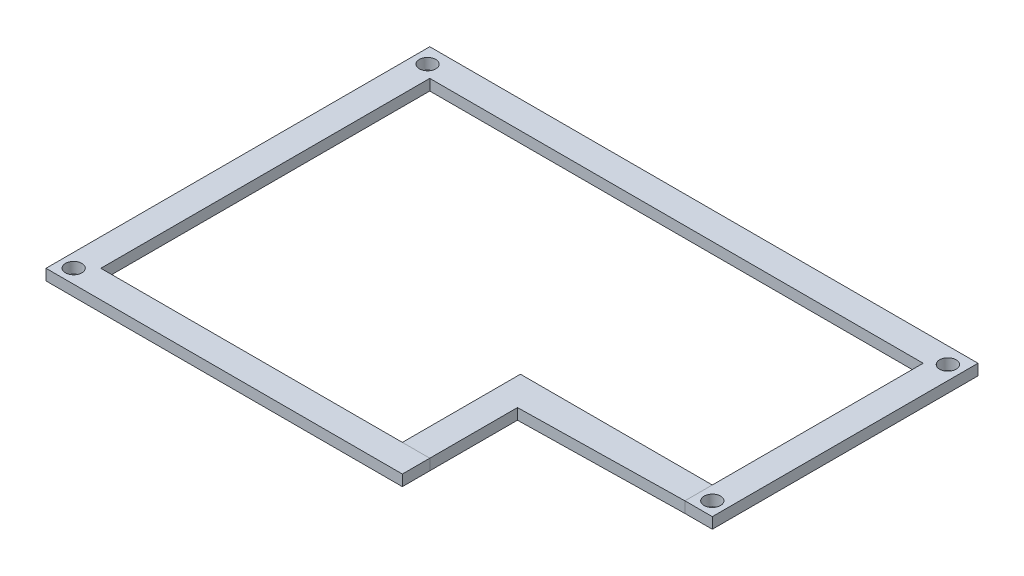
ISO-10303-21;
HEADER;
FILE_DESCRIPTION(('STEP AP214'),'2;1');
FILE_NAME('part.step','',(''),(''),'','','');
FILE_SCHEMA(('AUTOMOTIVE_DESIGN { 1 0 10303 214 1 1 1 1 }'));
ENDSEC;
DATA;
#1=APPLICATION_CONTEXT('core data for automotive mechanical design processes');
#2=APPLICATION_PROTOCOL_DEFINITION('international standard','automotive_design',2000,#1);
#3=PRODUCT_CONTEXT('',#1,'mechanical');
#4=PRODUCT('Part','Part','',(#3));
#5=PRODUCT_RELATED_PRODUCT_CATEGORY('part','',(#4));
#6=PRODUCT_DEFINITION_FORMATION('','',#4);
#7=PRODUCT_DEFINITION_CONTEXT('part definition',#1,'design');
#8=PRODUCT_DEFINITION('design','',#6,#7);
#9=PRODUCT_DEFINITION_SHAPE('','',#8);
#10=(LENGTH_UNIT() NAMED_UNIT(*) SI_UNIT(.MILLI.,.METRE.));
#11=(NAMED_UNIT(*) PLANE_ANGLE_UNIT() SI_UNIT($,.RADIAN.));
#12=(NAMED_UNIT(*) SI_UNIT($,.STERADIAN.) SOLID_ANGLE_UNIT());
#13=UNCERTAINTY_MEASURE_WITH_UNIT(LENGTH_MEASURE(1.E-05),#10,'distance_accuracy_value','');
#14=(GEOMETRIC_REPRESENTATION_CONTEXT(3) GLOBAL_UNCERTAINTY_ASSIGNED_CONTEXT((#13)) GLOBAL_UNIT_ASSIGNED_CONTEXT((#10,
#11,#12)) REPRESENTATION_CONTEXT('',''));
#15=CARTESIAN_POINT('',(0.,0.,0.));
#16=DIRECTION('',(0.,0.,1.));
#17=DIRECTION('',(1.,0.,0.));
#18=AXIS2_PLACEMENT_3D('',#15,#16,#17);
#19=CARTESIAN_POINT('',(10.,0.,30.));
#20=DIRECTION('',(0.,0.,1.));
#21=DIRECTION('',(1.,0.,0.));
#22=AXIS2_PLACEMENT_3D('',#19,#20,#21);
#23=PLANE('',#22);
#24=DIRECTION('',(1.,0.,0.));
#25=VECTOR('',#24,1.);
#26=CARTESIAN_POINT('',(10.,2.,30.));
#27=LINE('',#26,#25);
#28=CARTESIAN_POINT('',(10.,2.,30.));
#29=VERTEX_POINT('',#28);
#30=CARTESIAN_POINT('',(15.,2.,30.));
#31=VERTEX_POINT('',#30);
#32=EDGE_CURVE('E138',#29,#31,#27,.T.);
#33=ORIENTED_EDGE('',*,*,#32,.F.);
#34=DIRECTION('',(0.,1.,0.));
#35=VECTOR('',#34,1.);
#36=CARTESIAN_POINT('',(10.,0.,30.));
#37=LINE('',#36,#35);
#38=CARTESIAN_POINT('',(10.,0.,30.));
#39=VERTEX_POINT('',#38);
#40=EDGE_CURVE('E12',#39,#29,#37,.T.);
#41=ORIENTED_EDGE('',*,*,#40,.F.);
#42=DIRECTION('',(1.,0.,0.));
#43=VECTOR('',#42,1.);
#44=CARTESIAN_POINT('',(10.,0.,30.));
#45=LINE('',#44,#43);
#46=CARTESIAN_POINT('',(15.,0.,30.));
#47=VERTEX_POINT('',#46);
#48=EDGE_CURVE('E152',#39,#47,#45,.T.);
#49=ORIENTED_EDGE('',*,*,#48,.T.);
#50=DIRECTION('',(0.,1.,0.));
#51=VECTOR('',#50,1.);
#52=CARTESIAN_POINT('',(15.,0.,30.));
#53=LINE('',#52,#51);
#54=EDGE_CURVE('E56',#47,#31,#53,.T.);
#55=ORIENTED_EDGE('',*,*,#54,.T.);
#56=EDGE_LOOP('',(#33,#41,#49,#55));
#57=FACE_BOUND('',#56,.T.);
#58=ADVANCED_FACE('F53',(#57),#23,.T.);
#59=CARTESIAN_POINT('',(9.99999999999999,0.,8.45999999999999));
#60=DIRECTION('',(-1.,0.,0.));
#61=DIRECTION('',(0.,0.,1.));
#62=AXIS2_PLACEMENT_3D('',#59,#60,#61);
#63=PLANE('',#62);
#64=DIRECTION('',(0.,0.,1.));
#65=VECTOR('',#64,1.);
#66=CARTESIAN_POINT('',(9.99999999999999,2.,8.45999999999999));
#67=LINE('',#66,#65);
#68=CARTESIAN_POINT('',(9.99999999999999,2.,8.45999999999999));
#69=VERTEX_POINT('',#68);
#70=EDGE_CURVE('E150',#69,#29,#67,.T.);
#71=ORIENTED_EDGE('',*,*,#70,.F.);
#72=DIRECTION('',(0.,1.,0.));
#73=VECTOR('',#72,1.);
#74=CARTESIAN_POINT('',(9.99999999999999,0.,8.45999999999999));
#75=LINE('',#74,#73);
#76=CARTESIAN_POINT('',(9.99999999999999,0.,8.45999999999999));
#77=VERTEX_POINT('',#76);
#78=EDGE_CURVE('E62',#77,#69,#75,.T.);
#79=ORIENTED_EDGE('',*,*,#78,.F.);
#80=DIRECTION('',(0.,0.,1.));
#81=VECTOR('',#80,1.);
#82=CARTESIAN_POINT('',(9.99999999999999,0.,8.45999999999999));
#83=LINE('',#82,#81);
#84=EDGE_CURVE('E128',#77,#39,#83,.T.);
#85=ORIENTED_EDGE('',*,*,#84,.T.);
#86=ORIENTED_EDGE('',*,*,#40,.T.);
#87=EDGE_LOOP('',(#71,#79,#85,#86));
#88=FACE_BOUND('',#87,.T.);
#89=ADVANCED_FACE('F160',(#88),#63,.T.);
#90=CARTESIAN_POINT('',(45.,0.,8.45999999999998));
#91=DIRECTION('',(0.,0.,-1.));
#92=DIRECTION('',(-1.,0.,0.));
#93=AXIS2_PLACEMENT_3D('',#90,#91,#92);
#94=PLANE('',#93);
#95=DIRECTION('',(-1.,0.,0.));
#96=VECTOR('',#95,1.);
#97=CARTESIAN_POINT('',(45.,2.,8.45999999999998));
#98=LINE('',#97,#96);
#99=CARTESIAN_POINT('',(45.,2.,8.45999999999998));
#100=VERTEX_POINT('',#99);
#101=EDGE_CURVE('E115',#100,#69,#98,.T.);
#102=ORIENTED_EDGE('',*,*,#101,.F.);
#103=DIRECTION('',(0.,1.,0.));
#104=VECTOR('',#103,1.);
#105=CARTESIAN_POINT('',(45.,0.,8.45999999999998));
#106=LINE('',#105,#104);
#107=CARTESIAN_POINT('',(45.,0.,8.45999999999998));
#108=VERTEX_POINT('',#107);
#109=EDGE_CURVE('E110',#108,#100,#106,.T.);
#110=ORIENTED_EDGE('',*,*,#109,.F.);
#111=DIRECTION('',(-1.,0.,0.));
#112=VECTOR('',#111,1.);
#113=CARTESIAN_POINT('',(45.,0.,8.45999999999998));
#114=LINE('',#113,#112);
#115=EDGE_CURVE('E113',#108,#77,#114,.T.);
#116=ORIENTED_EDGE('',*,*,#115,.T.);
#117=ORIENTED_EDGE('',*,*,#78,.T.);
#118=EDGE_LOOP('',(#102,#110,#116,#117));
#119=FACE_BOUND('',#118,.T.);
#120=ADVANCED_FACE('F112',(#119),#94,.T.);
#121=CARTESIAN_POINT('',(45.,0.,13.46));
#122=DIRECTION('',(1.,0.,0.));
#123=DIRECTION('',(0.,0.,-1.));
#124=AXIS2_PLACEMENT_3D('',#121,#122,#123);
#125=PLANE('',#124);
#126=DIRECTION('',(0.,0.,-1.));
#127=VECTOR('',#126,1.);
#128=CARTESIAN_POINT('',(45.,2.,13.46));
#129=LINE('',#128,#127);
#130=CARTESIAN_POINT('',(45.,2.,13.46));
#131=VERTEX_POINT('',#130);
#132=EDGE_CURVE('E147',#131,#100,#129,.T.);
#133=ORIENTED_EDGE('',*,*,#132,.F.);
#134=DIRECTION('',(0.,1.,0.));
#135=VECTOR('',#134,1.);
#136=CARTESIAN_POINT('',(45.,0.,13.46));
#137=LINE('',#136,#135);
#138=CARTESIAN_POINT('',(45.,0.,13.46));
#139=VERTEX_POINT('',#138);
#140=EDGE_CURVE('E120',#139,#131,#137,.T.);
#141=ORIENTED_EDGE('',*,*,#140,.F.);
#142=DIRECTION('',(0.,0.,-1.));
#143=VECTOR('',#142,1.);
#144=CARTESIAN_POINT('',(45.,0.,13.46));
#145=LINE('',#144,#143);
#146=EDGE_CURVE('E126',#139,#108,#145,.T.);
#147=ORIENTED_EDGE('',*,*,#146,.T.);
#148=ORIENTED_EDGE('',*,*,#109,.T.);
#149=EDGE_LOOP('',(#133,#141,#147,#148));
#150=FACE_BOUND('',#149,.T.);
#151=ADVANCED_FACE('F130',(#150),#125,.T.);
#152=CARTESIAN_POINT('',(15.,0.,14.));
#153=DIRECTION('',(0.0179970847083967,0.,0.999838039355374));
#154=DIRECTION('',(0.999838039355374,0.,-0.0179970847083967));
#155=AXIS2_PLACEMENT_3D('',#152,#153,#154);
#156=PLANE('',#155);
#157=DIRECTION('',(0.999838039355374,0.,-0.0179970847083967));
#158=VECTOR('',#157,1.);
#159=CARTESIAN_POINT('',(15.,2.,14.));
#160=LINE('',#159,#158);
#161=CARTESIAN_POINT('',(15.,2.,14.));
#162=VERTEX_POINT('',#161);
#163=EDGE_CURVE('E144',#162,#131,#160,.T.);
#164=ORIENTED_EDGE('',*,*,#163,.F.);
#165=DIRECTION('',(0.,1.,0.));
#166=VECTOR('',#165,1.);
#167=CARTESIAN_POINT('',(15.,0.,14.));
#168=LINE('',#167,#166);
#169=CARTESIAN_POINT('',(15.,0.,14.));
#170=VERTEX_POINT('',#169);
#171=EDGE_CURVE('E155',#170,#162,#168,.T.);
#172=ORIENTED_EDGE('',*,*,#171,.F.);
#173=DIRECTION('',(0.999838039355374,0.,-0.0179970847083967));
#174=VECTOR('',#173,1.);
#175=CARTESIAN_POINT('',(15.,0.,14.));
#176=LINE('',#175,#174);
#177=EDGE_CURVE('E131',#170,#139,#176,.T.);
#178=ORIENTED_EDGE('',*,*,#177,.T.);
#179=ORIENTED_EDGE('',*,*,#140,.T.);
#180=EDGE_LOOP('',(#164,#172,#178,#179));
#181=FACE_BOUND('',#180,.T.);
#182=ADVANCED_FACE('F173',(#181),#156,.T.);
#183=CARTESIAN_POINT('',(15.,0.,30.));
#184=DIRECTION('',(1.,0.,0.));
#185=DIRECTION('',(0.,0.,-1.));
#186=AXIS2_PLACEMENT_3D('',#183,#184,#185);
#187=PLANE('',#186);
#188=DIRECTION('',(0.,0.,-1.));
#189=VECTOR('',#188,1.);
#190=CARTESIAN_POINT('',(15.,2.,30.));
#191=LINE('',#190,#189);
#192=EDGE_CURVE('E141',#31,#162,#191,.T.);
#193=ORIENTED_EDGE('',*,*,#192,.F.);
#194=ORIENTED_EDGE('',*,*,#54,.F.);
#195=DIRECTION('',(0.,0.,-1.));
#196=VECTOR('',#195,1.);
#197=CARTESIAN_POINT('',(15.,0.,30.));
#198=LINE('',#197,#196);
#199=EDGE_CURVE('E133',#47,#170,#198,.T.);
#200=ORIENTED_EDGE('',*,*,#199,.T.);
#201=ORIENTED_EDGE('',*,*,#171,.T.);
#202=EDGE_LOOP('',(#193,#194,#200,#201));
#203=FACE_BOUND('',#202,.T.);
#204=ADVANCED_FACE('F157',(#203),#187,.T.);
#205=CARTESIAN_POINT('',(0.,0.,0.));
#206=DIRECTION('',(0.,1.,0.));
#207=DIRECTION('',(0.,0.,1.));
#208=AXIS2_PLACEMENT_3D('',#205,#206,#207);
#209=PLANE('',#208);
#210=ORIENTED_EDGE('',*,*,#48,.F.);
#211=ORIENTED_EDGE('',*,*,#84,.F.);
#212=ORIENTED_EDGE('',*,*,#115,.F.);
#213=ORIENTED_EDGE('',*,*,#146,.F.);
#214=ORIENTED_EDGE('',*,*,#177,.F.);
#215=ORIENTED_EDGE('',*,*,#199,.F.);
#216=EDGE_LOOP('',(#210,#211,#212,#213,#214,#215));
#217=FACE_BOUND('',#216,.T.);
#218=ADVANCED_FACE('F124',(#217),#209,.F.);
#219=CARTESIAN_POINT('',(0.,2.,0.));
#220=DIRECTION('',(0.,1.,0.));
#221=DIRECTION('',(0.,0.,1.));
#222=AXIS2_PLACEMENT_3D('',#219,#220,#221);
#223=PLANE('',#222);
#224=ORIENTED_EDGE('',*,*,#32,.T.);
#225=ORIENTED_EDGE('',*,*,#192,.T.);
#226=ORIENTED_EDGE('',*,*,#163,.T.);
#227=ORIENTED_EDGE('',*,*,#132,.T.);
#228=ORIENTED_EDGE('',*,*,#101,.T.);
#229=ORIENTED_EDGE('',*,*,#70,.T.);
#230=EDGE_LOOP('',(#224,#225,#226,#227,#228,#229));
#231=FACE_BOUND('',#230,.T.);
#232=ADVANCED_FACE('F159',(#231),#223,.T.);
#233=CLOSED_SHELL('',(#58,#89,#120,#151,#182,#204,#218,#232));
#234=MANIFOLD_SOLID_BREP('B2',#233);
#235=CARTESIAN_POINT('',(0.,2.,0.));
#236=DIRECTION('',(0.,1.,0.));
#237=DIRECTION('',(0.,0.,1.));
#238=AXIS2_PLACEMENT_3D('',#235,#236,#237);
#239=PLANE('',#238);
#240=CARTESIAN_POINT('',(-47.5,2.,32.45));
#241=DIRECTION('',(0.,1.,0.));
#242=DIRECTION('',(0.,0.,1.));
#243=AXIS2_PLACEMENT_3D('',#240,#241,#242);
#244=CIRCLE('',#243,1.5);
#245=CARTESIAN_POINT('',(-47.5,2.,33.95));
#246=VERTEX_POINT('',#245);
#247=EDGE_CURVE('E470',#246,#246,#244,.T.);
#248=ORIENTED_EDGE('',*,*,#247,.F.);
#249=EDGE_LOOP('',(#248));
#250=FACE_BOUND('',#249,.T.);
#251=CARTESIAN_POINT('',(47.5,2.,10.96));
#252=DIRECTION('',(0.,1.,0.));
#253=DIRECTION('',(0.,0.,1.));
#254=AXIS2_PLACEMENT_3D('',#251,#252,#253);
#255=CIRCLE('',#254,1.5);
#256=CARTESIAN_POINT('',(47.5,2.,12.46));
#257=VERTEX_POINT('',#256);
#258=EDGE_CURVE('E478',#257,#257,#255,.T.);
#259=ORIENTED_EDGE('',*,*,#258,.F.);
#260=EDGE_LOOP('',(#259));
#261=FACE_BOUND('',#260,.T.);
#262=CARTESIAN_POINT('',(47.45,2.,-32.05));
#263=DIRECTION('',(0.,1.,0.));
#264=DIRECTION('',(0.,0.,1.));
#265=AXIS2_PLACEMENT_3D('',#262,#263,#264);
#266=CIRCLE('',#265,1.5);
#267=CARTESIAN_POINT('',(47.45,2.,-30.55));
#268=VERTEX_POINT('',#267);
#269=EDGE_CURVE('E464',#268,#268,#266,.T.);
#270=ORIENTED_EDGE('',*,*,#269,.F.);
#271=EDGE_LOOP('',(#270));
#272=FACE_BOUND('',#271,.T.);
#273=CARTESIAN_POINT('',(-47.45,2.,-32.05));
#274=DIRECTION('',(0.,1.,0.));
#275=DIRECTION('',(0.,0.,1.));
#276=AXIS2_PLACEMENT_3D('',#273,#274,#275);
#277=CIRCLE('',#276,1.5);
#278=CARTESIAN_POINT('',(-47.45,2.,-30.55));
#279=VERTEX_POINT('',#278);
#280=EDGE_CURVE('E457',#279,#279,#277,.T.);
#281=ORIENTED_EDGE('',*,*,#280,.F.);
#282=EDGE_LOOP('',(#281));
#283=FACE_BOUND('',#282,.T.);
#284=DIRECTION('',(0.,0.,1.));
#285=VECTOR('',#284,1.);
#286=CARTESIAN_POINT('',(15.,2.,35.));
#287=LINE('',#286,#285);
#288=CARTESIAN_POINT('',(15.,2.,30.));
#289=VERTEX_POINT('',#288);
#290=CARTESIAN_POINT('',(15.,2.,35.));
#291=VERTEX_POINT('',#290);
#292=EDGE_CURVE('E328',#289,#291,#287,.T.);
#293=ORIENTED_EDGE('',*,*,#292,.F.);
#294=DIRECTION('',(1.,0.,0.));
#295=VECTOR('',#294,1.);
#296=CARTESIAN_POINT('',(-45.,2.,30.));
#297=LINE('',#296,#295);
#298=CARTESIAN_POINT('',(-45.,2.,30.));
#299=VERTEX_POINT('',#298);
#300=EDGE_CURVE('E385',#299,#289,#297,.T.);
#301=ORIENTED_EDGE('',*,*,#300,.F.);
#302=DIRECTION('',(0.,0.,1.));
#303=VECTOR('',#302,1.);
#304=CARTESIAN_POINT('',(-45.,2.,-30.));
#305=LINE('',#304,#303);
#306=CARTESIAN_POINT('',(-45.,2.,-30.));
#307=VERTEX_POINT('',#306);
#308=EDGE_CURVE('E393',#307,#299,#305,.T.);
#309=ORIENTED_EDGE('',*,*,#308,.F.);
#310=DIRECTION('',(-1.,0.,0.));
#311=VECTOR('',#310,1.);
#312=CARTESIAN_POINT('',(-45.,2.,-30.));
#313=LINE('',#312,#311);
#314=CARTESIAN_POINT('',(45.,2.,-30.));
#315=VERTEX_POINT('',#314);
#316=EDGE_CURVE('E398',#315,#307,#313,.T.);
#317=ORIENTED_EDGE('',*,*,#316,.F.);
#318=DIRECTION('',(0.,0.,-1.));
#319=VECTOR('',#318,1.);
#320=CARTESIAN_POINT('',(45.,2.,-30.));
#321=LINE('',#320,#319);
#322=CARTESIAN_POINT('',(45.,2.,13.46));
#323=VERTEX_POINT('',#322);
#324=EDGE_CURVE('E415',#323,#315,#321,.T.);
#325=ORIENTED_EDGE('',*,*,#324,.F.);
#326=DIRECTION('',(-1.,0.,0.));
#327=VECTOR('',#326,1.);
#328=CARTESIAN_POINT('',(50.,2.,13.46));
#329=LINE('',#328,#327);
#330=CARTESIAN_POINT('',(50.,2.,13.46));
#331=VERTEX_POINT('',#330);
#332=EDGE_CURVE('E260',#331,#323,#329,.T.);
#333=ORIENTED_EDGE('',*,*,#332,.F.);
#334=DIRECTION('',(0.,0.,-1.));
#335=VECTOR('',#334,1.);
#336=CARTESIAN_POINT('',(50.,2.,-35.));
#337=LINE('',#336,#335);
#338=CARTESIAN_POINT('',(50.,2.,-35.));
#339=VERTEX_POINT('',#338);
#340=EDGE_CURVE('E335',#331,#339,#337,.T.);
#341=ORIENTED_EDGE('',*,*,#340,.T.);
#342=DIRECTION('',(-1.,0.,0.));
#343=VECTOR('',#342,1.);
#344=CARTESIAN_POINT('',(-50.,2.,-35.));
#345=LINE('',#344,#343);
#346=CARTESIAN_POINT('',(-50.,2.,-35.));
#347=VERTEX_POINT('',#346);
#348=EDGE_CURVE('E421',#339,#347,#345,.T.);
#349=ORIENTED_EDGE('',*,*,#348,.T.);
#350=DIRECTION('',(0.,0.,1.));
#351=VECTOR('',#350,1.);
#352=CARTESIAN_POINT('',(-50.,2.,-35.));
#353=LINE('',#352,#351);
#354=CARTESIAN_POINT('',(-50.,2.,35.));
#355=VERTEX_POINT('',#354);
#356=EDGE_CURVE('E423',#347,#355,#353,.T.);
#357=ORIENTED_EDGE('',*,*,#356,.T.);
#358=DIRECTION('',(1.,0.,0.));
#359=VECTOR('',#358,1.);
#360=CARTESIAN_POINT('',(-50.,2.,35.));
#361=LINE('',#360,#359);
#362=EDGE_CURVE('E355',#355,#291,#361,.T.);
#363=ORIENTED_EDGE('',*,*,#362,.T.);
#364=EDGE_LOOP('',(#293,#301,#309,#317,#325,#333,#341,#349,#357,#363));
#365=FACE_BOUND('',#364,.T.);
#366=ADVANCED_FACE('F245',(#250,#261,#272,#283,#365),#239,.T.);
#367=CARTESIAN_POINT('',(0.,0.,0.));
#368=DIRECTION('',(0.,1.,0.));
#369=DIRECTION('',(0.,0.,1.));
#370=AXIS2_PLACEMENT_3D('',#367,#368,#369);
#371=PLANE('',#370);
#372=CARTESIAN_POINT('',(-47.5,0.,32.45));
#373=DIRECTION('',(0.,1.,0.));
#374=DIRECTION('',(0.,0.,1.));
#375=AXIS2_PLACEMENT_3D('',#372,#373,#374);
#376=CIRCLE('',#375,1.5);
#377=CARTESIAN_POINT('',(-47.5,0.,33.95));
#378=VERTEX_POINT('',#377);
#379=EDGE_CURVE('E466',#378,#378,#376,.T.);
#380=ORIENTED_EDGE('',*,*,#379,.T.);
#381=EDGE_LOOP('',(#380));
#382=FACE_BOUND('',#381,.T.);
#383=CARTESIAN_POINT('',(47.5,0.,10.96));
#384=DIRECTION('',(0.,1.,0.));
#385=DIRECTION('',(0.,0.,1.));
#386=AXIS2_PLACEMENT_3D('',#383,#384,#385);
#387=CIRCLE('',#386,1.5);
#388=CARTESIAN_POINT('',(47.5,0.,12.46));
#389=VERTEX_POINT('',#388);
#390=EDGE_CURVE('E474',#389,#389,#387,.T.);
#391=ORIENTED_EDGE('',*,*,#390,.T.);
#392=EDGE_LOOP('',(#391));
#393=FACE_BOUND('',#392,.T.);
#394=CARTESIAN_POINT('',(47.45,0.,-32.05));
#395=DIRECTION('',(0.,1.,0.));
#396=DIRECTION('',(0.,0.,1.));
#397=AXIS2_PLACEMENT_3D('',#394,#395,#396);
#398=CIRCLE('',#397,1.5);
#399=CARTESIAN_POINT('',(47.45,0.,-30.55));
#400=VERTEX_POINT('',#399);
#401=EDGE_CURVE('E482',#400,#400,#398,.T.);
#402=ORIENTED_EDGE('',*,*,#401,.T.);
#403=EDGE_LOOP('',(#402));
#404=FACE_BOUND('',#403,.T.);
#405=CARTESIAN_POINT('',(-47.45,0.,-32.05));
#406=DIRECTION('',(0.,1.,0.));
#407=DIRECTION('',(0.,0.,1.));
#408=AXIS2_PLACEMENT_3D('',#405,#406,#407);
#409=CIRCLE('',#408,1.5);
#410=CARTESIAN_POINT('',(-47.45,0.,-30.55));
#411=VERTEX_POINT('',#410);
#412=EDGE_CURVE('E454',#411,#411,#409,.T.);
#413=ORIENTED_EDGE('',*,*,#412,.T.);
#414=EDGE_LOOP('',(#413));
#415=FACE_BOUND('',#414,.T.);
#416=DIRECTION('',(1.,0.,0.));
#417=VECTOR('',#416,1.);
#418=CARTESIAN_POINT('',(-45.,0.,30.));
#419=LINE('',#418,#417);
#420=CARTESIAN_POINT('',(-45.,0.,30.));
#421=VERTEX_POINT('',#420);
#422=CARTESIAN_POINT('',(15.,0.,30.));
#423=VERTEX_POINT('',#422);
#424=EDGE_CURVE('E413',#421,#423,#419,.T.);
#425=ORIENTED_EDGE('',*,*,#424,.T.);
#426=DIRECTION('',(0.,0.,1.));
#427=VECTOR('',#426,1.);
#428=CARTESIAN_POINT('',(15.,0.,35.));
#429=LINE('',#428,#427);
#430=CARTESIAN_POINT('',(15.,0.,35.));
#431=VERTEX_POINT('',#430);
#432=EDGE_CURVE('E268',#423,#431,#429,.T.);
#433=ORIENTED_EDGE('',*,*,#432,.T.);
#434=DIRECTION('',(1.,0.,0.));
#435=VECTOR('',#434,1.);
#436=CARTESIAN_POINT('',(-50.,0.,35.));
#437=LINE('',#436,#435);
#438=CARTESIAN_POINT('',(-50.,0.,35.));
#439=VERTEX_POINT('',#438);
#440=EDGE_CURVE('E360',#439,#431,#437,.T.);
#441=ORIENTED_EDGE('',*,*,#440,.F.);
#442=DIRECTION('',(0.,0.,1.));
#443=VECTOR('',#442,1.);
#444=CARTESIAN_POINT('',(-50.,0.,-35.));
#445=LINE('',#444,#443);
#446=CARTESIAN_POINT('',(-50.,0.,-35.));
#447=VERTEX_POINT('',#446);
#448=EDGE_CURVE('E349',#447,#439,#445,.T.);
#449=ORIENTED_EDGE('',*,*,#448,.F.);
#450=DIRECTION('',(-1.,0.,0.));
#451=VECTOR('',#450,1.);
#452=CARTESIAN_POINT('',(-50.,0.,-35.));
#453=LINE('',#452,#451);
#454=CARTESIAN_POINT('',(50.,0.,-35.));
#455=VERTEX_POINT('',#454);
#456=EDGE_CURVE('E342',#455,#447,#453,.T.);
#457=ORIENTED_EDGE('',*,*,#456,.F.);
#458=DIRECTION('',(0.,0.,-1.));
#459=VECTOR('',#458,1.);
#460=CARTESIAN_POINT('',(50.,0.,-35.));
#461=LINE('',#460,#459);
#462=CARTESIAN_POINT('',(50.,0.,13.46));
#463=VERTEX_POINT('',#462);
#464=EDGE_CURVE('E333',#463,#455,#461,.T.);
#465=ORIENTED_EDGE('',*,*,#464,.F.);
#466=DIRECTION('',(-1.,0.,0.));
#467=VECTOR('',#466,1.);
#468=CARTESIAN_POINT('',(50.,0.,13.46));
#469=LINE('',#468,#467);
#470=CARTESIAN_POINT('',(45.,0.,13.46));
#471=VERTEX_POINT('',#470);
#472=EDGE_CURVE('E320',#463,#471,#469,.T.);
#473=ORIENTED_EDGE('',*,*,#472,.T.);
#474=DIRECTION('',(0.,0.,-1.));
#475=VECTOR('',#474,1.);
#476=CARTESIAN_POINT('',(45.,0.,-30.));
#477=LINE('',#476,#475);
#478=CARTESIAN_POINT('',(45.,0.,-30.));
#479=VERTEX_POINT('',#478);
#480=EDGE_CURVE('E402',#471,#479,#477,.T.);
#481=ORIENTED_EDGE('',*,*,#480,.T.);
#482=DIRECTION('',(-1.,0.,0.));
#483=VECTOR('',#482,1.);
#484=CARTESIAN_POINT('',(-45.,0.,-30.));
#485=LINE('',#484,#483);
#486=CARTESIAN_POINT('',(-45.,0.,-30.));
#487=VERTEX_POINT('',#486);
#488=EDGE_CURVE('E405',#479,#487,#485,.T.);
#489=ORIENTED_EDGE('',*,*,#488,.T.);
#490=DIRECTION('',(0.,0.,1.));
#491=VECTOR('',#490,1.);
#492=CARTESIAN_POINT('',(-45.,0.,-30.));
#493=LINE('',#492,#491);
#494=EDGE_CURVE('E409',#487,#421,#493,.T.);
#495=ORIENTED_EDGE('',*,*,#494,.T.);
#496=EDGE_LOOP('',(#425,#433,#441,#449,#457,#465,#473,#481,#489,#495));
#497=FACE_BOUND('',#496,.T.);
#498=ADVANCED_FACE('F340',(#382,#393,#404,#415,#497),#371,.F.);
#499=CARTESIAN_POINT('',(50.,2.,-35.));
#500=DIRECTION('',(-1.,0.,0.));
#501=DIRECTION('',(0.,0.,1.));
#502=AXIS2_PLACEMENT_3D('',#499,#500,#501);
#503=PLANE('',#502);
#504=ORIENTED_EDGE('',*,*,#340,.F.);
#505=DIRECTION('',(0.,1.,0.));
#506=VECTOR('',#505,1.);
#507=CARTESIAN_POINT('',(50.,0.,13.46));
#508=LINE('',#507,#506);
#509=EDGE_CURVE('E323',#463,#331,#508,.T.);
#510=ORIENTED_EDGE('',*,*,#509,.F.);
#511=ORIENTED_EDGE('',*,*,#464,.T.);
#512=DIRECTION('',(0.,-1.,0.));
#513=VECTOR('',#512,1.);
#514=CARTESIAN_POINT('',(50.,2.,-35.));
#515=LINE('',#514,#513);
#516=EDGE_CURVE('E372',#339,#455,#515,.T.);
#517=ORIENTED_EDGE('',*,*,#516,.F.);
#518=EDGE_LOOP('',(#504,#510,#511,#517));
#519=FACE_BOUND('',#518,.T.);
#520=ADVANCED_FACE('F247',(#519),#503,.F.);
#521=CARTESIAN_POINT('',(-50.,2.,-35.));
#522=DIRECTION('',(0.,0.,1.));
#523=DIRECTION('',(1.,0.,0.));
#524=AXIS2_PLACEMENT_3D('',#521,#522,#523);
#525=PLANE('',#524);
#526=ORIENTED_EDGE('',*,*,#456,.T.);
#527=DIRECTION('',(0.,-1.,0.));
#528=VECTOR('',#527,1.);
#529=CARTESIAN_POINT('',(-50.,2.,-35.));
#530=LINE('',#529,#528);
#531=EDGE_CURVE('E368',#347,#447,#530,.T.);
#532=ORIENTED_EDGE('',*,*,#531,.F.);
#533=ORIENTED_EDGE('',*,*,#348,.F.);
#534=ORIENTED_EDGE('',*,*,#516,.T.);
#535=EDGE_LOOP('',(#526,#532,#533,#534));
#536=FACE_BOUND('',#535,.T.);
#537=ADVANCED_FACE('F531',(#536),#525,.F.);
#538=CARTESIAN_POINT('',(-50.,2.,-35.));
#539=DIRECTION('',(1.,0.,0.));
#540=DIRECTION('',(0.,0.,-1.));
#541=AXIS2_PLACEMENT_3D('',#538,#539,#540);
#542=PLANE('',#541);
#543=ORIENTED_EDGE('',*,*,#448,.T.);
#544=DIRECTION('',(0.,-1.,0.));
#545=VECTOR('',#544,1.);
#546=CARTESIAN_POINT('',(-50.,2.,35.));
#547=LINE('',#546,#545);
#548=EDGE_CURVE('E364',#355,#439,#547,.T.);
#549=ORIENTED_EDGE('',*,*,#548,.F.);
#550=ORIENTED_EDGE('',*,*,#356,.F.);
#551=ORIENTED_EDGE('',*,*,#531,.T.);
#552=EDGE_LOOP('',(#543,#549,#550,#551));
#553=FACE_BOUND('',#552,.T.);
#554=ADVANCED_FACE('F431',(#553),#542,.F.);
#555=CARTESIAN_POINT('',(-50.,2.,35.));
#556=DIRECTION('',(0.,0.,-1.));
#557=DIRECTION('',(-1.,0.,0.));
#558=AXIS2_PLACEMENT_3D('',#555,#556,#557);
#559=PLANE('',#558);
#560=ORIENTED_EDGE('',*,*,#440,.T.);
#561=DIRECTION('',(0.,1.,0.));
#562=VECTOR('',#561,1.);
#563=CARTESIAN_POINT('',(15.,0.,35.));
#564=LINE('',#563,#562);
#565=EDGE_CURVE('E337',#431,#291,#564,.T.);
#566=ORIENTED_EDGE('',*,*,#565,.T.);
#567=ORIENTED_EDGE('',*,*,#362,.F.);
#568=ORIENTED_EDGE('',*,*,#548,.T.);
#569=EDGE_LOOP('',(#560,#566,#567,#568));
#570=FACE_BOUND('',#569,.T.);
#571=ADVANCED_FACE('F434',(#570),#559,.F.);
#572=CARTESIAN_POINT('',(45.,2.,-30.));
#573=DIRECTION('',(-1.,0.,0.));
#574=DIRECTION('',(0.,0.,1.));
#575=AXIS2_PLACEMENT_3D('',#572,#573,#574);
#576=PLANE('',#575);
#577=DIRECTION('',(0.,-1.,0.));
#578=VECTOR('',#577,1.);
#579=CARTESIAN_POINT('',(45.,2.,13.46));
#580=LINE('',#579,#578);
#581=EDGE_CURVE('E51',#323,#471,#580,.T.);
#582=ORIENTED_EDGE('',*,*,#581,.F.);
#583=ORIENTED_EDGE('',*,*,#324,.T.);
#584=DIRECTION('',(0.,-1.,0.));
#585=VECTOR('',#584,1.);
#586=CARTESIAN_POINT('',(45.,2.,-30.));
#587=LINE('',#586,#585);
#588=EDGE_CURVE('E345',#315,#479,#587,.T.);
#589=ORIENTED_EDGE('',*,*,#588,.T.);
#590=ORIENTED_EDGE('',*,*,#480,.F.);
#591=EDGE_LOOP('',(#582,#583,#589,#590));
#592=FACE_BOUND('',#591,.T.);
#593=ADVANCED_FACE('F452',(#592),#576,.T.);
#594=CARTESIAN_POINT('',(-45.,2.,-30.));
#595=DIRECTION('',(0.,0.,1.));
#596=DIRECTION('',(1.,0.,0.));
#597=AXIS2_PLACEMENT_3D('',#594,#595,#596);
#598=PLANE('',#597);
#599=ORIENTED_EDGE('',*,*,#488,.F.);
#600=ORIENTED_EDGE('',*,*,#588,.F.);
#601=ORIENTED_EDGE('',*,*,#316,.T.);
#602=DIRECTION('',(0.,-1.,0.));
#603=VECTOR('',#602,1.);
#604=CARTESIAN_POINT('',(-45.,2.,-30.));
#605=LINE('',#604,#603);
#606=EDGE_CURVE('E352',#307,#487,#605,.T.);
#607=ORIENTED_EDGE('',*,*,#606,.T.);
#608=EDGE_LOOP('',(#599,#600,#601,#607));
#609=FACE_BOUND('',#608,.T.);
#610=ADVANCED_FACE('F446',(#609),#598,.T.);
#611=CARTESIAN_POINT('',(-45.,2.,-30.));
#612=DIRECTION('',(1.,0.,0.));
#613=DIRECTION('',(0.,0.,-1.));
#614=AXIS2_PLACEMENT_3D('',#611,#612,#613);
#615=PLANE('',#614);
#616=ORIENTED_EDGE('',*,*,#494,.F.);
#617=ORIENTED_EDGE('',*,*,#606,.F.);
#618=ORIENTED_EDGE('',*,*,#308,.T.);
#619=DIRECTION('',(0.,-1.,0.));
#620=VECTOR('',#619,1.);
#621=CARTESIAN_POINT('',(-45.,2.,30.));
#622=LINE('',#621,#620);
#623=EDGE_CURVE('E390',#299,#421,#622,.T.);
#624=ORIENTED_EDGE('',*,*,#623,.T.);
#625=EDGE_LOOP('',(#616,#617,#618,#624));
#626=FACE_BOUND('',#625,.T.);
#627=ADVANCED_FACE('F450',(#626),#615,.T.);
#628=CARTESIAN_POINT('',(-45.,2.,30.));
#629=DIRECTION('',(0.,0.,-1.));
#630=DIRECTION('',(-1.,0.,0.));
#631=AXIS2_PLACEMENT_3D('',#628,#629,#630);
#632=PLANE('',#631);
#633=DIRECTION('',(0.,1.,0.));
#634=VECTOR('',#633,1.);
#635=CARTESIAN_POINT('',(15.,2.,30.));
#636=LINE('',#635,#634);
#637=EDGE_CURVE('E254',#423,#289,#636,.T.);
#638=ORIENTED_EDGE('',*,*,#637,.F.);
#639=ORIENTED_EDGE('',*,*,#424,.F.);
#640=ORIENTED_EDGE('',*,*,#623,.F.);
#641=ORIENTED_EDGE('',*,*,#300,.T.);
#642=EDGE_LOOP('',(#638,#639,#640,#641));
#643=FACE_BOUND('',#642,.T.);
#644=ADVANCED_FACE('F389',(#643),#632,.T.);
#645=CARTESIAN_POINT('',(15.,0.,35.));
#646=DIRECTION('',(-1.,0.,0.));
#647=DIRECTION('',(0.,0.,1.));
#648=AXIS2_PLACEMENT_3D('',#645,#646,#647);
#649=PLANE('',#648);
#650=ORIENTED_EDGE('',*,*,#637,.T.);
#651=ORIENTED_EDGE('',*,*,#292,.T.);
#652=ORIENTED_EDGE('',*,*,#565,.F.);
#653=ORIENTED_EDGE('',*,*,#432,.F.);
#654=EDGE_LOOP('',(#650,#651,#652,#653));
#655=FACE_BOUND('',#654,.T.);
#656=ADVANCED_FACE('F376',(#655),#649,.F.);
#657=CARTESIAN_POINT('',(50.,0.,13.46));
#658=DIRECTION('',(0.,0.,-1.));
#659=DIRECTION('',(-1.,0.,0.));
#660=AXIS2_PLACEMENT_3D('',#657,#658,#659);
#661=PLANE('',#660);
#662=ORIENTED_EDGE('',*,*,#581,.T.);
#663=ORIENTED_EDGE('',*,*,#472,.F.);
#664=ORIENTED_EDGE('',*,*,#509,.T.);
#665=ORIENTED_EDGE('',*,*,#332,.T.);
#666=EDGE_LOOP('',(#662,#663,#664,#665));
#667=FACE_BOUND('',#666,.T.);
#668=ADVANCED_FACE('F322',(#667),#661,.F.);
#669=CARTESIAN_POINT('',(-47.45,0.,-32.05));
#670=DIRECTION('',(0.,1.,0.));
#671=DIRECTION('',(0.,0.,1.));
#672=AXIS2_PLACEMENT_3D('',#669,#670,#671);
#673=CYLINDRICAL_SURFACE('',#672,1.5);
#674=ORIENTED_EDGE('',*,*,#412,.F.);
#675=EDGE_LOOP('',(#674));
#676=FACE_BOUND('',#675,.T.);
#677=ORIENTED_EDGE('',*,*,#280,.T.);
#678=EDGE_LOOP('',(#677));
#679=FACE_BOUND('',#678,.T.);
#680=ADVANCED_FACE('F498',(#676,#679),#673,.F.);
#681=CARTESIAN_POINT('',(47.45,0.,-32.05));
#682=DIRECTION('',(0.,1.,0.));
#683=DIRECTION('',(0.,0.,1.));
#684=AXIS2_PLACEMENT_3D('',#681,#682,#683);
#685=CYLINDRICAL_SURFACE('',#684,1.5);
#686=ORIENTED_EDGE('',*,*,#401,.F.);
#687=EDGE_LOOP('',(#686));
#688=FACE_BOUND('',#687,.T.);
#689=ORIENTED_EDGE('',*,*,#269,.T.);
#690=EDGE_LOOP('',(#689));
#691=FACE_BOUND('',#690,.T.);
#692=ADVANCED_FACE('F490',(#688,#691),#685,.F.);
#693=CARTESIAN_POINT('',(47.5,0.,10.96));
#694=DIRECTION('',(0.,1.,0.));
#695=DIRECTION('',(0.,0.,1.));
#696=AXIS2_PLACEMENT_3D('',#693,#694,#695);
#697=CYLINDRICAL_SURFACE('',#696,1.5);
#698=ORIENTED_EDGE('',*,*,#390,.F.);
#699=EDGE_LOOP('',(#698));
#700=FACE_BOUND('',#699,.T.);
#701=ORIENTED_EDGE('',*,*,#258,.T.);
#702=EDGE_LOOP('',(#701));
#703=FACE_BOUND('',#702,.T.);
#704=ADVANCED_FACE('F506',(#700,#703),#697,.F.);
#705=CARTESIAN_POINT('',(-47.5,0.,32.45));
#706=DIRECTION('',(0.,1.,0.));
#707=DIRECTION('',(0.,0.,1.));
#708=AXIS2_PLACEMENT_3D('',#705,#706,#707);
#709=CYLINDRICAL_SURFACE('',#708,1.5);
#710=ORIENTED_EDGE('',*,*,#379,.F.);
#711=EDGE_LOOP('',(#710));
#712=FACE_BOUND('',#711,.T.);
#713=ORIENTED_EDGE('',*,*,#247,.T.);
#714=EDGE_LOOP('',(#713));
#715=FACE_BOUND('',#714,.T.);
#716=ADVANCED_FACE('F513',(#712,#715),#709,.F.);
#717=CLOSED_SHELL('',(#366,#498,#520,#537,#554,#571,#593,#610,#627,#644,#656,#668,#680,#692,
#704,#716));
#718=MANIFOLD_SOLID_BREP('B6',#717);
#719=ADVANCED_BREP_SHAPE_REPRESENTATION('',(#18,#234,#718),#14);
#720=SHAPE_DEFINITION_REPRESENTATION(#9,#719);
ENDSEC;
END-ISO-10303-21;
